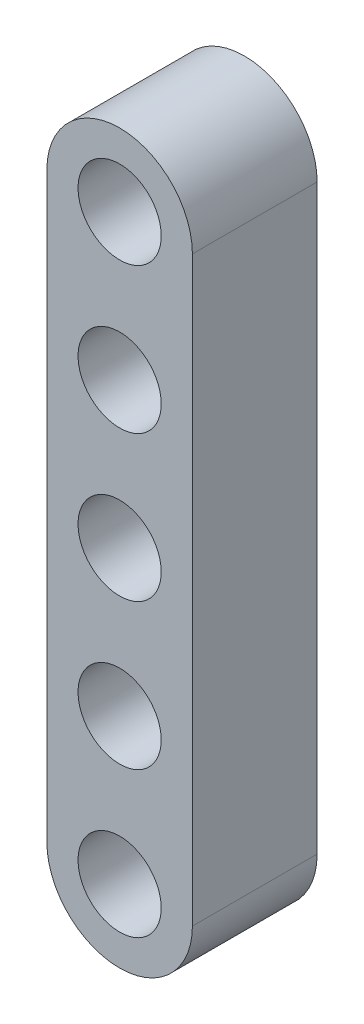
ISO-10303-21;
HEADER;
FILE_DESCRIPTION(('STEP AP214'),'2;1');
FILE_NAME('part.step','',(''),(''),'','','');
FILE_SCHEMA(('AUTOMOTIVE_DESIGN { 1 0 10303 214 1 1 1 1 }'));
ENDSEC;
DATA;
#1=APPLICATION_CONTEXT('core data for automotive mechanical design processes');
#2=APPLICATION_PROTOCOL_DEFINITION('international standard','automotive_design',2000,#1);
#3=PRODUCT_CONTEXT('',#1,'mechanical');
#4=PRODUCT('Part','Part','',(#3));
#5=PRODUCT_RELATED_PRODUCT_CATEGORY('part','',(#4));
#6=PRODUCT_DEFINITION_FORMATION('','',#4);
#7=PRODUCT_DEFINITION_CONTEXT('part definition',#1,'design');
#8=PRODUCT_DEFINITION('design','',#6,#7);
#9=PRODUCT_DEFINITION_SHAPE('','',#8);
#10=(LENGTH_UNIT() NAMED_UNIT(*) SI_UNIT(.MILLI.,.METRE.));
#11=(NAMED_UNIT(*) PLANE_ANGLE_UNIT() SI_UNIT($,.RADIAN.));
#12=(NAMED_UNIT(*) SI_UNIT($,.STERADIAN.) SOLID_ANGLE_UNIT());
#13=UNCERTAINTY_MEASURE_WITH_UNIT(LENGTH_MEASURE(1.E-05),#10,'distance_accuracy_value','');
#14=(GEOMETRIC_REPRESENTATION_CONTEXT(3) GLOBAL_UNCERTAINTY_ASSIGNED_CONTEXT((#13)) GLOBAL_UNIT_ASSIGNED_CONTEXT((#10,
#11,#12)) REPRESENTATION_CONTEXT('',''));
#15=CARTESIAN_POINT('',(0.,0.,0.));
#16=DIRECTION('',(0.,0.,1.));
#17=DIRECTION('',(1.,0.,0.));
#18=AXIS2_PLACEMENT_3D('',#15,#16,#17);
#19=CARTESIAN_POINT('',(0.,0.,6.));
#20=DIRECTION('',(0.,0.,1.));
#21=DIRECTION('',(1.,0.,0.));
#22=AXIS2_PLACEMENT_3D('',#19,#20,#21);
#23=PLANE('',#22);
#24=CARTESIAN_POINT('',(0.,21.,6.));
#25=DIRECTION('',(0.,0.,1.));
#26=DIRECTION('',(1.,0.,0.));
#27=AXIS2_PLACEMENT_3D('',#24,#25,#26);
#28=CIRCLE('',#27,2.);
#29=CARTESIAN_POINT('',(2.,21.,6.));
#30=VERTEX_POINT('',#29);
#31=EDGE_CURVE('E127',#30,#30,#28,.T.);
#32=ORIENTED_EDGE('',*,*,#31,.F.);
#33=EDGE_LOOP('',(#32));
#34=FACE_BOUND('',#33,.T.);
#35=CARTESIAN_POINT('',(0.,7.,6.));
#36=DIRECTION('',(0.,0.,1.));
#37=DIRECTION('',(1.,0.,0.));
#38=AXIS2_PLACEMENT_3D('',#35,#36,#37);
#39=CIRCLE('',#38,2.);
#40=CARTESIAN_POINT('',(2.,7.,6.));
#41=VERTEX_POINT('',#40);
#42=EDGE_CURVE('E115',#41,#41,#39,.T.);
#43=ORIENTED_EDGE('',*,*,#42,.F.);
#44=EDGE_LOOP('',(#43));
#45=FACE_BOUND('',#44,.T.);
#46=CARTESIAN_POINT('',(0.,0.,6.));
#47=DIRECTION('',(0.,0.,1.));
#48=DIRECTION('',(1.,0.,0.));
#49=AXIS2_PLACEMENT_3D('',#46,#47,#48);
#50=CIRCLE('',#49,3.5);
#51=CARTESIAN_POINT('',(-3.5,0.,6.));
#52=VERTEX_POINT('',#51);
#53=CARTESIAN_POINT('',(3.5,0.,6.));
#54=VERTEX_POINT('',#53);
#55=EDGE_CURVE('E85',#52,#54,#50,.T.);
#56=ORIENTED_EDGE('',*,*,#55,.T.);
#57=DIRECTION('',(0.,1.,0.));
#58=VECTOR('',#57,1.);
#59=CARTESIAN_POINT('',(3.5,0.,6.));
#60=LINE('',#59,#58);
#61=CARTESIAN_POINT('',(3.5,28.,6.));
#62=VERTEX_POINT('',#61);
#63=EDGE_CURVE('E80',#54,#62,#60,.T.);
#64=ORIENTED_EDGE('',*,*,#63,.T.);
#65=CARTESIAN_POINT('',(0.,28.,6.));
#66=DIRECTION('',(0.,0.,1.));
#67=DIRECTION('',(1.,0.,0.));
#68=AXIS2_PLACEMENT_3D('',#65,#66,#67);
#69=CIRCLE('',#68,3.5);
#70=CARTESIAN_POINT('',(-3.5,28.,6.));
#71=VERTEX_POINT('',#70);
#72=EDGE_CURVE('E83',#62,#71,#69,.T.);
#73=ORIENTED_EDGE('',*,*,#72,.T.);
#74=DIRECTION('',(0.,-1.,0.));
#75=VECTOR('',#74,1.);
#76=CARTESIAN_POINT('',(-3.5,0.,6.));
#77=LINE('',#76,#75);
#78=EDGE_CURVE('E50',#71,#52,#77,.T.);
#79=ORIENTED_EDGE('',*,*,#78,.T.);
#80=EDGE_LOOP('',(#56,#64,#73,#79));
#81=FACE_BOUND('',#80,.T.);
#82=CARTESIAN_POINT('',(0.,0.,6.));
#83=DIRECTION('',(0.,0.,1.));
#84=DIRECTION('',(1.,0.,0.));
#85=AXIS2_PLACEMENT_3D('',#82,#83,#84);
#86=CIRCLE('',#85,2.);
#87=CARTESIAN_POINT('',(2.,0.,6.));
#88=VERTEX_POINT('',#87);
#89=EDGE_CURVE('E100',#88,#88,#86,.T.);
#90=ORIENTED_EDGE('',*,*,#89,.F.);
#91=EDGE_LOOP('',(#90));
#92=FACE_BOUND('',#91,.T.);
#93=CARTESIAN_POINT('',(0.,14.,6.));
#94=DIRECTION('',(0.,0.,1.));
#95=DIRECTION('',(1.,0.,0.));
#96=AXIS2_PLACEMENT_3D('',#93,#94,#95);
#97=CIRCLE('',#96,2.);
#98=CARTESIAN_POINT('',(2.,14.,6.));
#99=VERTEX_POINT('',#98);
#100=EDGE_CURVE('E121',#99,#99,#97,.T.);
#101=ORIENTED_EDGE('',*,*,#100,.F.);
#102=EDGE_LOOP('',(#101));
#103=FACE_BOUND('',#102,.T.);
#104=CARTESIAN_POINT('',(0.,28.,6.));
#105=DIRECTION('',(0.,0.,1.));
#106=DIRECTION('',(1.,0.,0.));
#107=AXIS2_PLACEMENT_3D('',#104,#105,#106);
#108=CIRCLE('',#107,2.);
#109=CARTESIAN_POINT('',(2.,28.,6.));
#110=VERTEX_POINT('',#109);
#111=EDGE_CURVE('E133',#110,#110,#108,.T.);
#112=ORIENTED_EDGE('',*,*,#111,.F.);
#113=EDGE_LOOP('',(#112));
#114=FACE_BOUND('',#113,.T.);
#115=ADVANCED_FACE('F33',(#34,#45,#81,#92,#103,#114),#23,.T.);
#116=CARTESIAN_POINT('',(0.,0.,0.));
#117=DIRECTION('',(0.,0.,1.));
#118=DIRECTION('',(1.,0.,0.));
#119=AXIS2_PLACEMENT_3D('',#116,#117,#118);
#120=PLANE('',#119);
#121=CARTESIAN_POINT('',(0.,0.,0.));
#122=DIRECTION('',(0.,0.,1.));
#123=DIRECTION('',(1.,0.,0.));
#124=AXIS2_PLACEMENT_3D('',#121,#122,#123);
#125=CIRCLE('',#124,3.5);
#126=CARTESIAN_POINT('',(-3.5,0.,0.));
#127=VERTEX_POINT('',#126);
#128=CARTESIAN_POINT('',(3.5,0.,0.));
#129=VERTEX_POINT('',#128);
#130=EDGE_CURVE('E97',#127,#129,#125,.T.);
#131=ORIENTED_EDGE('',*,*,#130,.F.);
#132=DIRECTION('',(0.,-1.,0.));
#133=VECTOR('',#132,1.);
#134=CARTESIAN_POINT('',(-3.5,0.,0.));
#135=LINE('',#134,#133);
#136=CARTESIAN_POINT('',(-3.5,28.,0.));
#137=VERTEX_POINT('',#136);
#138=EDGE_CURVE('E73',#137,#127,#135,.T.);
#139=ORIENTED_EDGE('',*,*,#138,.F.);
#140=CARTESIAN_POINT('',(0.,28.,0.));
#141=DIRECTION('',(0.,0.,1.));
#142=DIRECTION('',(1.,0.,0.));
#143=AXIS2_PLACEMENT_3D('',#140,#141,#142);
#144=CIRCLE('',#143,3.5);
#145=CARTESIAN_POINT('',(3.5,28.,0.));
#146=VERTEX_POINT('',#145);
#147=EDGE_CURVE('E67',#146,#137,#144,.T.);
#148=ORIENTED_EDGE('',*,*,#147,.F.);
#149=DIRECTION('',(0.,1.,0.));
#150=VECTOR('',#149,1.);
#151=CARTESIAN_POINT('',(3.5,0.,0.));
#152=LINE('',#151,#150);
#153=EDGE_CURVE('E89',#129,#146,#152,.T.);
#154=ORIENTED_EDGE('',*,*,#153,.F.);
#155=EDGE_LOOP('',(#131,#139,#148,#154));
#156=FACE_BOUND('',#155,.T.);
#157=CARTESIAN_POINT('',(0.,0.,0.));
#158=DIRECTION('',(0.,0.,1.));
#159=DIRECTION('',(1.,0.,0.));
#160=AXIS2_PLACEMENT_3D('',#157,#158,#159);
#161=CIRCLE('',#160,2.);
#162=CARTESIAN_POINT('',(2.,0.,0.));
#163=VERTEX_POINT('',#162);
#164=EDGE_CURVE('E112',#163,#163,#161,.T.);
#165=ORIENTED_EDGE('',*,*,#164,.T.);
#166=EDGE_LOOP('',(#165));
#167=FACE_BOUND('',#166,.T.);
#168=CARTESIAN_POINT('',(0.,7.,0.));
#169=DIRECTION('',(0.,0.,1.));
#170=DIRECTION('',(1.,0.,0.));
#171=AXIS2_PLACEMENT_3D('',#168,#169,#170);
#172=CIRCLE('',#171,2.);
#173=CARTESIAN_POINT('',(2.,7.,0.));
#174=VERTEX_POINT('',#173);
#175=EDGE_CURVE('E118',#174,#174,#172,.T.);
#176=ORIENTED_EDGE('',*,*,#175,.T.);
#177=EDGE_LOOP('',(#176));
#178=FACE_BOUND('',#177,.T.);
#179=CARTESIAN_POINT('',(0.,14.,0.));
#180=DIRECTION('',(0.,0.,1.));
#181=DIRECTION('',(1.,0.,0.));
#182=AXIS2_PLACEMENT_3D('',#179,#180,#181);
#183=CIRCLE('',#182,2.);
#184=CARTESIAN_POINT('',(2.,14.,0.));
#185=VERTEX_POINT('',#184);
#186=EDGE_CURVE('E124',#185,#185,#183,.T.);
#187=ORIENTED_EDGE('',*,*,#186,.T.);
#188=EDGE_LOOP('',(#187));
#189=FACE_BOUND('',#188,.T.);
#190=CARTESIAN_POINT('',(0.,21.,0.));
#191=DIRECTION('',(0.,0.,1.));
#192=DIRECTION('',(1.,0.,0.));
#193=AXIS2_PLACEMENT_3D('',#190,#191,#192);
#194=CIRCLE('',#193,2.);
#195=CARTESIAN_POINT('',(2.,21.,0.));
#196=VERTEX_POINT('',#195);
#197=EDGE_CURVE('E130',#196,#196,#194,.T.);
#198=ORIENTED_EDGE('',*,*,#197,.T.);
#199=EDGE_LOOP('',(#198));
#200=FACE_BOUND('',#199,.T.);
#201=CARTESIAN_POINT('',(0.,28.,0.));
#202=DIRECTION('',(0.,0.,1.));
#203=DIRECTION('',(1.,0.,0.));
#204=AXIS2_PLACEMENT_3D('',#201,#202,#203);
#205=CIRCLE('',#204,2.);
#206=CARTESIAN_POINT('',(2.,28.,0.));
#207=VERTEX_POINT('',#206);
#208=EDGE_CURVE('E136',#207,#207,#205,.T.);
#209=ORIENTED_EDGE('',*,*,#208,.T.);
#210=EDGE_LOOP('',(#209));
#211=FACE_BOUND('',#210,.T.);
#212=ADVANCED_FACE('F108',(#156,#167,#178,#189,#200,#211),#120,.F.);
#213=CARTESIAN_POINT('',(0.,0.,6.));
#214=DIRECTION('',(0.,0.,-1.));
#215=DIRECTION('',(-1.,0.,0.));
#216=AXIS2_PLACEMENT_3D('',#213,#214,#215);
#217=CYLINDRICAL_SURFACE('',#216,3.5);
#218=ORIENTED_EDGE('',*,*,#130,.T.);
#219=DIRECTION('',(0.,0.,-1.));
#220=VECTOR('',#219,1.);
#221=CARTESIAN_POINT('',(3.5,0.,6.));
#222=LINE('',#221,#220);
#223=EDGE_CURVE('E11',#54,#129,#222,.T.);
#224=ORIENTED_EDGE('',*,*,#223,.F.);
#225=ORIENTED_EDGE('',*,*,#55,.F.);
#226=DIRECTION('',(0.,0.,-1.));
#227=VECTOR('',#226,1.);
#228=CARTESIAN_POINT('',(-3.5,0.,6.));
#229=LINE('',#228,#227);
#230=EDGE_CURVE('E93',#52,#127,#229,.T.);
#231=ORIENTED_EDGE('',*,*,#230,.T.);
#232=EDGE_LOOP('',(#218,#224,#225,#231));
#233=FACE_BOUND('',#232,.T.);
#234=ADVANCED_FACE('F35',(#233),#217,.T.);
#235=CARTESIAN_POINT('',(3.5,0.,6.));
#236=DIRECTION('',(-1.,0.,0.));
#237=DIRECTION('',(0.,-1.,0.));
#238=AXIS2_PLACEMENT_3D('',#235,#236,#237);
#239=PLANE('',#238);
#240=ORIENTED_EDGE('',*,*,#153,.T.);
#241=DIRECTION('',(0.,0.,-1.));
#242=VECTOR('',#241,1.);
#243=CARTESIAN_POINT('',(3.5,28.,6.));
#244=LINE('',#243,#242);
#245=EDGE_CURVE('E42',#62,#146,#244,.T.);
#246=ORIENTED_EDGE('',*,*,#245,.F.);
#247=ORIENTED_EDGE('',*,*,#63,.F.);
#248=ORIENTED_EDGE('',*,*,#223,.T.);
#249=EDGE_LOOP('',(#240,#246,#247,#248));
#250=FACE_BOUND('',#249,.T.);
#251=ADVANCED_FACE('F88',(#250),#239,.F.);
#252=CARTESIAN_POINT('',(0.,28.,6.));
#253=DIRECTION('',(0.,0.,-1.));
#254=DIRECTION('',(-1.,0.,0.));
#255=AXIS2_PLACEMENT_3D('',#252,#253,#254);
#256=CYLINDRICAL_SURFACE('',#255,3.5);
#257=ORIENTED_EDGE('',*,*,#147,.T.);
#258=DIRECTION('',(0.,0.,-1.));
#259=VECTOR('',#258,1.);
#260=CARTESIAN_POINT('',(-3.5,28.,6.));
#261=LINE('',#260,#259);
#262=EDGE_CURVE('E90',#71,#137,#261,.T.);
#263=ORIENTED_EDGE('',*,*,#262,.F.);
#264=ORIENTED_EDGE('',*,*,#72,.F.);
#265=ORIENTED_EDGE('',*,*,#245,.T.);
#266=EDGE_LOOP('',(#257,#263,#264,#265));
#267=FACE_BOUND('',#266,.T.);
#268=ADVANCED_FACE('F91',(#267),#256,.T.);
#269=CARTESIAN_POINT('',(-3.5,0.,6.));
#270=DIRECTION('',(1.,0.,0.));
#271=DIRECTION('',(0.,1.,0.));
#272=AXIS2_PLACEMENT_3D('',#269,#270,#271);
#273=PLANE('',#272);
#274=ORIENTED_EDGE('',*,*,#138,.T.);
#275=ORIENTED_EDGE('',*,*,#230,.F.);
#276=ORIENTED_EDGE('',*,*,#78,.F.);
#277=ORIENTED_EDGE('',*,*,#262,.T.);
#278=EDGE_LOOP('',(#274,#275,#276,#277));
#279=FACE_BOUND('',#278,.T.);
#280=ADVANCED_FACE('F105',(#279),#273,.F.);
#281=CARTESIAN_POINT('',(0.,0.,6.));
#282=DIRECTION('',(0.,0.,-1.));
#283=DIRECTION('',(-1.,0.,0.));
#284=AXIS2_PLACEMENT_3D('',#281,#282,#283);
#285=CYLINDRICAL_SURFACE('',#284,2.);
#286=ORIENTED_EDGE('',*,*,#89,.T.);
#287=EDGE_LOOP('',(#286));
#288=FACE_BOUND('',#287,.T.);
#289=ORIENTED_EDGE('',*,*,#164,.F.);
#290=EDGE_LOOP('',(#289));
#291=FACE_BOUND('',#290,.T.);
#292=ADVANCED_FACE('F155',(#288,#291),#285,.F.);
#293=CARTESIAN_POINT('',(0.,7.,6.));
#294=DIRECTION('',(0.,0.,-1.));
#295=DIRECTION('',(-1.,0.,0.));
#296=AXIS2_PLACEMENT_3D('',#293,#294,#295);
#297=CYLINDRICAL_SURFACE('',#296,2.);
#298=ORIENTED_EDGE('',*,*,#42,.T.);
#299=EDGE_LOOP('',(#298));
#300=FACE_BOUND('',#299,.T.);
#301=ORIENTED_EDGE('',*,*,#175,.F.);
#302=EDGE_LOOP('',(#301));
#303=FACE_BOUND('',#302,.T.);
#304=ADVANCED_FACE('F201',(#300,#303),#297,.F.);
#305=CARTESIAN_POINT('',(0.,14.,6.));
#306=DIRECTION('',(0.,0.,-1.));
#307=DIRECTION('',(-1.,0.,0.));
#308=AXIS2_PLACEMENT_3D('',#305,#306,#307);
#309=CYLINDRICAL_SURFACE('',#308,2.);
#310=ORIENTED_EDGE('',*,*,#100,.T.);
#311=EDGE_LOOP('',(#310));
#312=FACE_BOUND('',#311,.T.);
#313=ORIENTED_EDGE('',*,*,#186,.F.);
#314=EDGE_LOOP('',(#313));
#315=FACE_BOUND('',#314,.T.);
#316=ADVANCED_FACE('F209',(#312,#315),#309,.F.);
#317=CARTESIAN_POINT('',(0.,21.,6.));
#318=DIRECTION('',(0.,0.,-1.));
#319=DIRECTION('',(-1.,0.,0.));
#320=AXIS2_PLACEMENT_3D('',#317,#318,#319);
#321=CYLINDRICAL_SURFACE('',#320,2.);
#322=ORIENTED_EDGE('',*,*,#31,.T.);
#323=EDGE_LOOP('',(#322));
#324=FACE_BOUND('',#323,.T.);
#325=ORIENTED_EDGE('',*,*,#197,.F.);
#326=EDGE_LOOP('',(#325));
#327=FACE_BOUND('',#326,.T.);
#328=ADVANCED_FACE('F217',(#324,#327),#321,.F.);
#329=CARTESIAN_POINT('',(0.,28.,6.));
#330=DIRECTION('',(0.,0.,-1.));
#331=DIRECTION('',(-1.,0.,0.));
#332=AXIS2_PLACEMENT_3D('',#329,#330,#331);
#333=CYLINDRICAL_SURFACE('',#332,2.);
#334=ORIENTED_EDGE('',*,*,#111,.T.);
#335=EDGE_LOOP('',(#334));
#336=FACE_BOUND('',#335,.T.);
#337=ORIENTED_EDGE('',*,*,#208,.F.);
#338=EDGE_LOOP('',(#337));
#339=FACE_BOUND('',#338,.T.);
#340=ADVANCED_FACE('F142',(#336,#339),#333,.F.);
#341=CLOSED_SHELL('',(#115,#212,#234,#251,#268,#280,#292,#304,#316,#328,#340));
#342=MANIFOLD_SOLID_BREP('B2',#341);
#343=ADVANCED_BREP_SHAPE_REPRESENTATION('',(#18,#342),#14);
#344=SHAPE_DEFINITION_REPRESENTATION(#9,#343);
ENDSEC;
END-ISO-10303-21;
